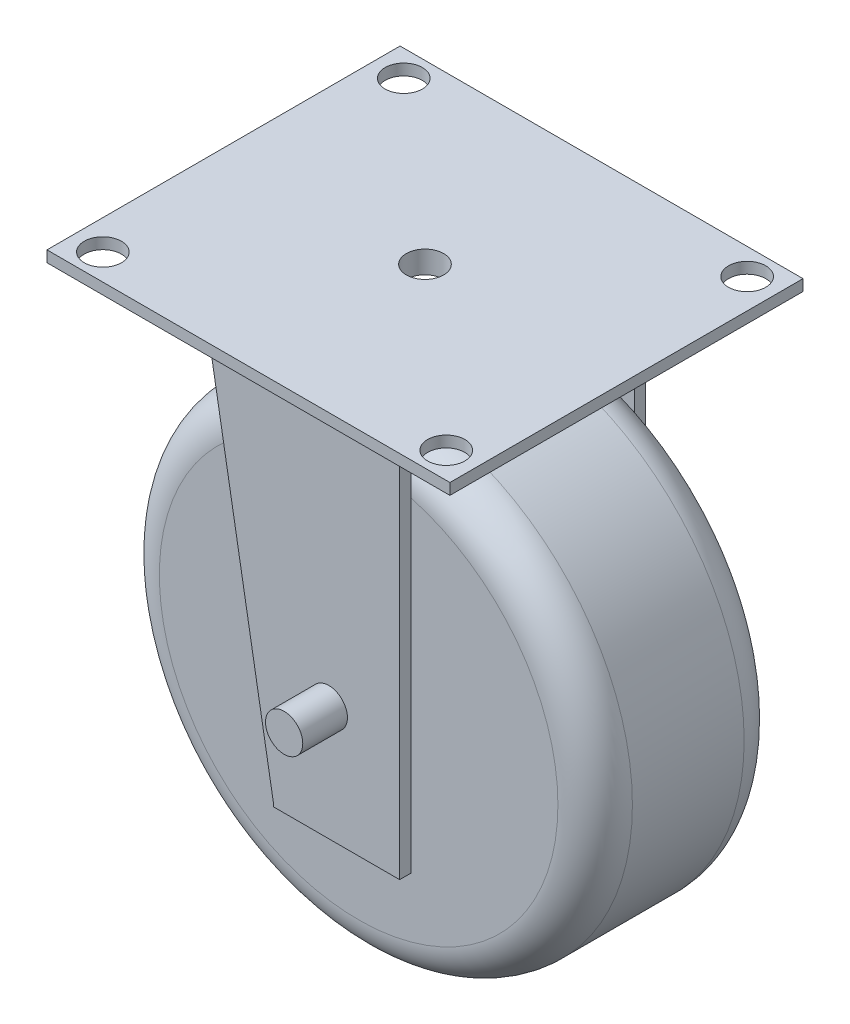
ISO-10303-21;
HEADER;
FILE_DESCRIPTION(('STEP AP214'),'2;1');
FILE_NAME('part.step','',(''),(''),'','','');
FILE_SCHEMA(('AUTOMOTIVE_DESIGN { 1 0 10303 214 1 1 1 1 }'));
ENDSEC;
DATA;
#1=APPLICATION_CONTEXT('core data for automotive mechanical design processes');
#2=APPLICATION_PROTOCOL_DEFINITION('international standard','automotive_design',2000,#1);
#3=PRODUCT_CONTEXT('',#1,'mechanical');
#4=PRODUCT('Part','Part','',(#3));
#5=PRODUCT_RELATED_PRODUCT_CATEGORY('part','',(#4));
#6=PRODUCT_DEFINITION_FORMATION('','',#4);
#7=PRODUCT_DEFINITION_CONTEXT('part definition',#1,'design');
#8=PRODUCT_DEFINITION('design','',#6,#7);
#9=PRODUCT_DEFINITION_SHAPE('','',#8);
#10=(LENGTH_UNIT() NAMED_UNIT(*) SI_UNIT(.MILLI.,.METRE.));
#11=(NAMED_UNIT(*) PLANE_ANGLE_UNIT() SI_UNIT($,.RADIAN.));
#12=(NAMED_UNIT(*) SI_UNIT($,.STERADIAN.) SOLID_ANGLE_UNIT());
#13=UNCERTAINTY_MEASURE_WITH_UNIT(LENGTH_MEASURE(1.E-05),#10,'distance_accuracy_value','');
#14=(GEOMETRIC_REPRESENTATION_CONTEXT(3) GLOBAL_UNCERTAINTY_ASSIGNED_CONTEXT((#13)) GLOBAL_UNIT_ASSIGNED_CONTEXT((#10,
#11,#12)) REPRESENTATION_CONTEXT('',''));
#15=CARTESIAN_POINT('',(0.,0.,0.));
#16=DIRECTION('',(0.,0.,1.));
#17=DIRECTION('',(1.,0.,0.));
#18=AXIS2_PLACEMENT_3D('',#15,#16,#17);
#19=CARTESIAN_POINT('',(0.,0.,70.));
#20=DIRECTION('',(0.,0.,-1.));
#21=DIRECTION('',(-1.,0.,0.));
#22=AXIS2_PLACEMENT_3D('',#19,#20,#21);
#23=CYLINDRICAL_SURFACE('',#22,5.);
#24=CARTESIAN_POINT('',(0.,0.,50.));
#25=DIRECTION('',(0.,0.,1.));
#26=DIRECTION('',(1.,0.,0.));
#27=AXIS2_PLACEMENT_3D('',#24,#25,#26);
#28=CIRCLE('',#27,5.);
#29=CARTESIAN_POINT('',(5.,0.,50.));
#30=VERTEX_POINT('',#29);
#31=EDGE_CURVE('E308',#30,#30,#28,.T.);
#32=ORIENTED_EDGE('',*,*,#31,.T.);
#33=EDGE_LOOP('',(#32));
#34=FACE_BOUND('',#33,.T.);
#35=CARTESIAN_POINT('',(0.,0.,55.));
#36=DIRECTION('',(0.,0.,1.));
#37=DIRECTION('',(1.,0.,0.));
#38=AXIS2_PLACEMENT_3D('',#35,#36,#37);
#39=CIRCLE('',#38,5.);
#40=CARTESIAN_POINT('',(5.,0.,55.));
#41=VERTEX_POINT('',#40);
#42=EDGE_CURVE('E50',#41,#41,#39,.T.);
#43=ORIENTED_EDGE('',*,*,#42,.F.);
#44=EDGE_LOOP('',(#43));
#45=FACE_BOUND('',#44,.T.);
#46=ADVANCED_FACE('F41',(#34,#45),#23,.T.);
#47=CARTESIAN_POINT('',(0.,0.,50.));
#48=DIRECTION('',(0.,0.,-1.));
#49=DIRECTION('',(-1.,0.,0.));
#50=AXIS2_PLACEMENT_3D('',#47,#48,#49);
#51=CYLINDRICAL_SURFACE('',#50,63.5);
#52=CARTESIAN_POINT('',(0.,0.,10.));
#53=DIRECTION('',(0.,0.,1.));
#54=DIRECTION('',(1.,0.,0.));
#55=AXIS2_PLACEMENT_3D('',#52,#53,#54);
#56=CIRCLE('',#55,63.5);
#57=CARTESIAN_POINT('',(63.5,0.,10.));
#58=VERTEX_POINT('',#57);
#59=EDGE_CURVE('E320',#58,#58,#56,.T.);
#60=ORIENTED_EDGE('',*,*,#59,.T.);
#61=EDGE_LOOP('',(#60));
#62=FACE_BOUND('',#61,.T.);
#63=CARTESIAN_POINT('',(0.,0.,40.));
#64=DIRECTION('',(0.,0.,1.));
#65=DIRECTION('',(1.,0.,0.));
#66=AXIS2_PLACEMENT_3D('',#63,#64,#65);
#67=CIRCLE('',#66,63.5);
#68=CARTESIAN_POINT('',(63.5,0.,40.));
#69=VERTEX_POINT('',#68);
#70=EDGE_CURVE('E317',#69,#69,#67,.F.);
#71=ORIENTED_EDGE('',*,*,#70,.T.);
#72=EDGE_LOOP('',(#71));
#73=FACE_BOUND('',#72,.T.);
#74=ADVANCED_FACE('F337',(#62,#73),#51,.T.);
#75=CARTESIAN_POINT('',(0.,0.,50.));
#76=DIRECTION('',(0.,0.,1.));
#77=DIRECTION('',(1.,0.,0.));
#78=AXIS2_PLACEMENT_3D('',#75,#76,#77);
#79=PLANE('',#78);
#80=ORIENTED_EDGE('',*,*,#31,.F.);
#81=EDGE_LOOP('',(#80));
#82=FACE_BOUND('',#81,.T.);
#83=CARTESIAN_POINT('',(0.,0.,50.));
#84=DIRECTION('',(0.,0.,1.));
#85=DIRECTION('',(1.,0.,0.));
#86=AXIS2_PLACEMENT_3D('',#83,#84,#85);
#87=CIRCLE('',#86,53.5);
#88=CARTESIAN_POINT('',(53.5,0.,50.));
#89=VERTEX_POINT('',#88);
#90=EDGE_CURVE('E326',#89,#89,#87,.T.);
#91=ORIENTED_EDGE('',*,*,#90,.T.);
#92=EDGE_LOOP('',(#91));
#93=FACE_BOUND('',#92,.T.);
#94=ADVANCED_FACE('F344',(#82,#93),#79,.T.);
#95=CARTESIAN_POINT('',(0.,0.,0.));
#96=DIRECTION('',(0.,0.,1.));
#97=DIRECTION('',(1.,0.,0.));
#98=AXIS2_PLACEMENT_3D('',#95,#96,#97);
#99=PLANE('',#98);
#100=CARTESIAN_POINT('',(0.,0.,0.));
#101=DIRECTION('',(0.,0.,1.));
#102=DIRECTION('',(1.,0.,0.));
#103=AXIS2_PLACEMENT_3D('',#100,#101,#102);
#104=CIRCLE('',#103,5.);
#105=CARTESIAN_POINT('',(5.,0.,0.));
#106=VERTEX_POINT('',#105);
#107=EDGE_CURVE('E329',#106,#106,#104,.F.);
#108=ORIENTED_EDGE('',*,*,#107,.F.);
#109=EDGE_LOOP('',(#108));
#110=FACE_BOUND('',#109,.T.);
#111=CARTESIAN_POINT('',(0.,0.,0.));
#112=DIRECTION('',(0.,0.,1.));
#113=DIRECTION('',(1.,0.,0.));
#114=AXIS2_PLACEMENT_3D('',#111,#112,#113);
#115=CIRCLE('',#114,53.5);
#116=CARTESIAN_POINT('',(53.5,0.,0.));
#117=VERTEX_POINT('',#116);
#118=EDGE_CURVE('E323',#117,#117,#115,.F.);
#119=ORIENTED_EDGE('',*,*,#118,.T.);
#120=EDGE_LOOP('',(#119));
#121=FACE_BOUND('',#120,.T.);
#122=ADVANCED_FACE('F453',(#110,#121),#99,.F.);
#123=CARTESIAN_POINT('',(0.,0.,10.));
#124=DIRECTION('',(0.,0.,1.));
#125=DIRECTION('',(1.,0.,0.));
#126=AXIS2_PLACEMENT_3D('',#123,#124,#125);
#127=TOROIDAL_SURFACE('',#126,53.5,10.);
#128=ORIENTED_EDGE('',*,*,#118,.F.);
#129=EDGE_LOOP('',(#128));
#130=FACE_BOUND('',#129,.T.);
#131=ORIENTED_EDGE('',*,*,#59,.F.);
#132=EDGE_LOOP('',(#131));
#133=FACE_BOUND('',#132,.T.);
#134=ADVANCED_FACE('F456',(#130,#133),#127,.T.);
#135=CARTESIAN_POINT('',(0.,0.,40.));
#136=DIRECTION('',(0.,0.,1.));
#137=DIRECTION('',(1.,0.,0.));
#138=AXIS2_PLACEMENT_3D('',#135,#136,#137);
#139=TOROIDAL_SURFACE('',#138,53.5,10.);
#140=ORIENTED_EDGE('',*,*,#70,.F.);
#141=EDGE_LOOP('',(#140));
#142=FACE_BOUND('',#141,.T.);
#143=ORIENTED_EDGE('',*,*,#90,.F.);
#144=EDGE_LOOP('',(#143));
#145=FACE_BOUND('',#144,.T.);
#146=ADVANCED_FACE('F43',(#142,#145),#139,.T.);
#147=CARTESIAN_POINT('',(0.,0.,-20.));
#148=DIRECTION('',(0.,0.,1.));
#149=DIRECTION('',(1.,0.,0.));
#150=AXIS2_PLACEMENT_3D('',#147,#148,#149);
#151=CYLINDRICAL_SURFACE('',#150,5.);
#152=CARTESIAN_POINT('',(0.,0.,-5.));
#153=DIRECTION('',(0.,0.,1.));
#154=DIRECTION('',(1.,0.,0.));
#155=AXIS2_PLACEMENT_3D('',#152,#153,#154);
#156=CIRCLE('',#155,5.);
#157=CARTESIAN_POINT('',(5.,0.,-5.));
#158=VERTEX_POINT('',#157);
#159=EDGE_CURVE('E244',#158,#158,#156,.T.);
#160=ORIENTED_EDGE('',*,*,#159,.T.);
#161=EDGE_LOOP('',(#160));
#162=FACE_BOUND('',#161,.T.);
#163=ORIENTED_EDGE('',*,*,#107,.T.);
#164=EDGE_LOOP('',(#163));
#165=FACE_BOUND('',#164,.T.);
#166=ADVANCED_FACE('F368',(#162,#165),#151,.T.);
#167=CARTESIAN_POINT('',(0.,0.,58.));
#168=DIRECTION('',(0.,0.,1.));
#169=DIRECTION('',(1.,0.,0.));
#170=AXIS2_PLACEMENT_3D('',#167,#168,#169);
#171=PLANE('',#170);
#172=DIRECTION('',(0.,-1.,0.));
#173=VECTOR('',#172,1.);
#174=CARTESIAN_POINT('',(-14.8477102055952,-29.8965705802547,58.));
#175=LINE('',#174,#173);
#176=CARTESIAN_POINT('',(-14.8477102055952,-29.8965705802547,58.));
#177=VERTEX_POINT('',#176);
#178=CARTESIAN_POINT('',(-14.8477102055952,-30.6411344370243,58.));
#179=VERTEX_POINT('',#178);
#180=EDGE_CURVE('E285',#177,#179,#175,.T.);
#181=ORIENTED_EDGE('',*,*,#180,.T.);
#182=DIRECTION('',(1.,0.,0.));
#183=VECTOR('',#182,1.);
#184=CARTESIAN_POINT('',(-14.8477102055952,-30.6411344370243,58.));
#185=LINE('',#184,#183);
#186=CARTESIAN_POINT('',(19.0088519192652,-30.6411344370243,58.));
#187=VERTEX_POINT('',#186);
#188=EDGE_CURVE('E91',#179,#187,#185,.T.);
#189=ORIENTED_EDGE('',*,*,#188,.T.);
#190=DIRECTION('',(0.,1.,0.));
#191=VECTOR('',#190,1.);
#192=CARTESIAN_POINT('',(19.0088519192652,-30.6411344370243,58.));
#193=LINE('',#192,#191);
#194=CARTESIAN_POINT('',(19.0088519192652,79.8505182146156,58.));
#195=VERTEX_POINT('',#194);
#196=EDGE_CURVE('E288',#187,#195,#193,.T.);
#197=ORIENTED_EDGE('',*,*,#196,.T.);
#198=DIRECTION('',(1.,0.,0.));
#199=VECTOR('',#198,1.);
#200=CARTESIAN_POINT('',(-33.3756531336716,79.8505182146156,58.));
#201=LINE('',#200,#199);
#202=CARTESIAN_POINT('',(-33.3756531336716,79.8505182146156,58.));
#203=VERTEX_POINT('',#202);
#204=EDGE_CURVE('E227',#203,#195,#201,.T.);
#205=ORIENTED_EDGE('',*,*,#204,.F.);
#206=DIRECTION('',(0.,-1.,0.));
#207=VECTOR('',#206,1.);
#208=CARTESIAN_POINT('',(-33.3756531336716,79.8505182146156,58.));
#209=LINE('',#208,#207);
#210=CARTESIAN_POINT('',(-33.3756531336716,76.8505182146156,58.));
#211=VERTEX_POINT('',#210);
#212=EDGE_CURVE('E242',#203,#211,#209,.T.);
#213=ORIENTED_EDGE('',*,*,#212,.T.);
#214=DIRECTION('',(0.171011760377526,-0.985268987542275,0.));
#215=VECTOR('',#214,1.);
#216=CARTESIAN_POINT('',(-33.3756531336716,76.8505182146156,58.));
#217=LINE('',#216,#215);
#218=EDGE_CURVE('E58',#211,#177,#217,.T.);
#219=ORIENTED_EDGE('',*,*,#218,.T.);
#220=EDGE_LOOP('',(#181,#189,#197,#205,#213,#219));
#221=FACE_BOUND('',#220,.T.);
#222=CARTESIAN_POINT('',(0.,0.,58.));
#223=DIRECTION('',(0.,0.,1.));
#224=DIRECTION('',(1.,0.,0.));
#225=AXIS2_PLACEMENT_3D('',#222,#223,#224);
#226=CIRCLE('',#225,5.);
#227=CARTESIAN_POINT('',(5.,0.,58.));
#228=VERTEX_POINT('',#227);
#229=EDGE_CURVE('E281',#228,#228,#226,.T.);
#230=ORIENTED_EDGE('',*,*,#229,.F.);
#231=EDGE_LOOP('',(#230));
#232=FACE_BOUND('',#231,.T.);
#233=ADVANCED_FACE('F366',(#221,#232),#171,.T.);
#234=CARTESIAN_POINT('',(0.,0.,55.));
#235=DIRECTION('',(0.,0.,1.));
#236=DIRECTION('',(1.,0.,0.));
#237=AXIS2_PLACEMENT_3D('',#234,#235,#236);
#238=PLANE('',#237);
#239=DIRECTION('',(0.,-1.,0.));
#240=VECTOR('',#239,1.);
#241=CARTESIAN_POINT('',(-14.8477102055952,-29.8965705802547,55.));
#242=LINE('',#241,#240);
#243=CARTESIAN_POINT('',(-14.8477102055952,-29.8965705802547,55.));
#244=VERTEX_POINT('',#243);
#245=CARTESIAN_POINT('',(-14.8477102055952,-30.6411344370243,55.));
#246=VERTEX_POINT('',#245);
#247=EDGE_CURVE('E284',#244,#246,#242,.T.);
#248=ORIENTED_EDGE('',*,*,#247,.F.);
#249=DIRECTION('',(0.171011760377526,-0.985268987542275,0.));
#250=VECTOR('',#249,1.);
#251=CARTESIAN_POINT('',(-33.3756531336716,76.8505182146156,55.));
#252=LINE('',#251,#250);
#253=CARTESIAN_POINT('',(-33.3756531336716,76.8505182146156,55.));
#254=VERTEX_POINT('',#253);
#255=EDGE_CURVE('E83',#254,#244,#252,.T.);
#256=ORIENTED_EDGE('',*,*,#255,.F.);
#257=DIRECTION('',(-1.,0.,0.));
#258=VECTOR('',#257,1.);
#259=CARTESIAN_POINT('',(19.0088519192652,76.8505182146156,55.));
#260=LINE('',#259,#258);
#261=CARTESIAN_POINT('',(19.0088519192652,76.8505182146156,55.));
#262=VERTEX_POINT('',#261);
#263=EDGE_CURVE('E297',#262,#254,#260,.T.);
#264=ORIENTED_EDGE('',*,*,#263,.F.);
#265=DIRECTION('',(0.,1.,0.));
#266=VECTOR('',#265,1.);
#267=CARTESIAN_POINT('',(19.0088519192652,-30.6411344370243,55.));
#268=LINE('',#267,#266);
#269=CARTESIAN_POINT('',(19.0088519192652,-30.6411344370243,55.));
#270=VERTEX_POINT('',#269);
#271=EDGE_CURVE('E76',#270,#262,#268,.T.);
#272=ORIENTED_EDGE('',*,*,#271,.F.);
#273=DIRECTION('',(1.,0.,0.));
#274=VECTOR('',#273,1.);
#275=CARTESIAN_POINT('',(-14.8477102055952,-30.6411344370243,55.));
#276=LINE('',#275,#274);
#277=EDGE_CURVE('E294',#246,#270,#276,.T.);
#278=ORIENTED_EDGE('',*,*,#277,.F.);
#279=EDGE_LOOP('',(#248,#256,#264,#272,#278));
#280=FACE_BOUND('',#279,.T.);
#281=ORIENTED_EDGE('',*,*,#42,.T.);
#282=EDGE_LOOP('',(#281));
#283=FACE_BOUND('',#282,.T.);
#284=ADVANCED_FACE('F334',(#280,#283),#238,.F.);
#285=CARTESIAN_POINT('',(-14.8477102055952,-29.8965705802547,58.));
#286=DIRECTION('',(1.,0.,0.));
#287=DIRECTION('',(0.,0.,-1.));
#288=AXIS2_PLACEMENT_3D('',#285,#286,#287);
#289=PLANE('',#288);
#290=ORIENTED_EDGE('',*,*,#247,.T.);
#291=DIRECTION('',(0.,0.,-1.));
#292=VECTOR('',#291,1.);
#293=CARTESIAN_POINT('',(-14.8477102055952,-30.6411344370243,58.));
#294=LINE('',#293,#292);
#295=EDGE_CURVE('E306',#179,#246,#294,.T.);
#296=ORIENTED_EDGE('',*,*,#295,.F.);
#297=ORIENTED_EDGE('',*,*,#180,.F.);
#298=DIRECTION('',(0.,0.,-1.));
#299=VECTOR('',#298,1.);
#300=CARTESIAN_POINT('',(-14.8477102055952,-29.8965705802547,58.));
#301=LINE('',#300,#299);
#302=EDGE_CURVE('E291',#177,#244,#301,.T.);
#303=ORIENTED_EDGE('',*,*,#302,.T.);
#304=EDGE_LOOP('',(#290,#296,#297,#303));
#305=FACE_BOUND('',#304,.T.);
#306=ADVANCED_FACE('F374',(#305),#289,.F.);
#307=CARTESIAN_POINT('',(-14.8477102055952,-30.6411344370243,58.));
#308=DIRECTION('',(0.,1.,0.));
#309=DIRECTION('',(0.,0.,1.));
#310=AXIS2_PLACEMENT_3D('',#307,#308,#309);
#311=PLANE('',#310);
#312=ORIENTED_EDGE('',*,*,#277,.T.);
#313=DIRECTION('',(0.,0.,-1.));
#314=VECTOR('',#313,1.);
#315=CARTESIAN_POINT('',(19.0088519192652,-30.6411344370243,58.));
#316=LINE('',#315,#314);
#317=EDGE_CURVE('E304',#187,#270,#316,.T.);
#318=ORIENTED_EDGE('',*,*,#317,.F.);
#319=ORIENTED_EDGE('',*,*,#188,.F.);
#320=ORIENTED_EDGE('',*,*,#295,.T.);
#321=EDGE_LOOP('',(#312,#318,#319,#320));
#322=FACE_BOUND('',#321,.T.);
#323=ADVANCED_FACE('F389',(#322),#311,.F.);
#324=CARTESIAN_POINT('',(19.0088519192652,-30.6411344370243,58.));
#325=DIRECTION('',(-1.,0.,0.));
#326=DIRECTION('',(0.,0.,1.));
#327=AXIS2_PLACEMENT_3D('',#324,#325,#326);
#328=PLANE('',#327);
#329=ORIENTED_EDGE('',*,*,#271,.T.);
#330=DIRECTION('',(0.,0.,-1.));
#331=VECTOR('',#330,1.);
#332=CARTESIAN_POINT('',(19.0088519192652,76.8505182146156,-8.));
#333=LINE('',#332,#331);
#334=CARTESIAN_POINT('',(19.0088519192652,76.8505182146156,-5.));
#335=VERTEX_POINT('',#334);
#336=EDGE_CURVE('E228',#262,#335,#333,.T.);
#337=ORIENTED_EDGE('',*,*,#336,.T.);
#338=DIRECTION('',(0.,1.,0.));
#339=VECTOR('',#338,1.);
#340=CARTESIAN_POINT('',(19.0088519192652,-30.6411344370243,-5.));
#341=LINE('',#340,#339);
#342=CARTESIAN_POINT('',(19.0088519192652,-30.6411344370243,-5.));
#343=VERTEX_POINT('',#342);
#344=EDGE_CURVE('E254',#343,#335,#341,.T.);
#345=ORIENTED_EDGE('',*,*,#344,.F.);
#346=DIRECTION('',(0.,0.,-1.));
#347=VECTOR('',#346,1.);
#348=CARTESIAN_POINT('',(19.0088519192652,-30.6411344370243,-5.));
#349=LINE('',#348,#347);
#350=CARTESIAN_POINT('',(19.0088519192652,-30.6411344370243,-8.));
#351=VERTEX_POINT('',#350);
#352=EDGE_CURVE('E275',#343,#351,#349,.T.);
#353=ORIENTED_EDGE('',*,*,#352,.T.);
#354=DIRECTION('',(0.,1.,0.));
#355=VECTOR('',#354,1.);
#356=CARTESIAN_POINT('',(19.0088519192652,-30.6411344370243,-8.));
#357=LINE('',#356,#355);
#358=CARTESIAN_POINT('',(19.0088519192652,79.8505182146156,-8.));
#359=VERTEX_POINT('',#358);
#360=EDGE_CURVE('E267',#351,#359,#357,.T.);
#361=ORIENTED_EDGE('',*,*,#360,.T.);
#362=DIRECTION('',(0.,0.,-1.));
#363=VECTOR('',#362,1.);
#364=CARTESIAN_POINT('',(19.0088519192652,79.8505182146156,-8.));
#365=LINE('',#364,#363);
#366=EDGE_CURVE('E231',#195,#359,#365,.T.);
#367=ORIENTED_EDGE('',*,*,#366,.F.);
#368=ORIENTED_EDGE('',*,*,#196,.F.);
#369=ORIENTED_EDGE('',*,*,#317,.T.);
#370=EDGE_LOOP('',(#329,#337,#345,#353,#361,#367,#368,#369));
#371=FACE_BOUND('',#370,.T.);
#372=ADVANCED_FACE('F386',(#371),#328,.F.);
#373=CARTESIAN_POINT('',(-33.3756531336716,76.8505182146156,58.));
#374=DIRECTION('',(0.985268987542275,0.171011760377526,0.));
#375=DIRECTION('',(-0.171011760377526,0.985268987542275,0.));
#376=AXIS2_PLACEMENT_3D('',#373,#374,#375);
#377=PLANE('',#376);
#378=ORIENTED_EDGE('',*,*,#255,.T.);
#379=ORIENTED_EDGE('',*,*,#302,.F.);
#380=ORIENTED_EDGE('',*,*,#218,.F.);
#381=DIRECTION('',(0.,0.,-1.));
#382=VECTOR('',#381,1.);
#383=CARTESIAN_POINT('',(-33.3756531336716,76.8505182146156,58.));
#384=LINE('',#383,#382);
#385=EDGE_CURVE('E302',#211,#254,#384,.T.);
#386=ORIENTED_EDGE('',*,*,#385,.T.);
#387=EDGE_LOOP('',(#378,#379,#380,#386));
#388=FACE_BOUND('',#387,.T.);
#389=ADVANCED_FACE('F360',(#388),#377,.F.);
#390=CARTESIAN_POINT('',(0.,0.,70.));
#391=DIRECTION('',(0.,0.,1.));
#392=DIRECTION('',(1.,0.,0.));
#393=AXIS2_PLACEMENT_3D('',#390,#391,#392);
#394=PLANE('',#393);
#395=CARTESIAN_POINT('',(0.,0.,70.));
#396=DIRECTION('',(0.,0.,1.));
#397=DIRECTION('',(1.,0.,0.));
#398=AXIS2_PLACEMENT_3D('',#395,#396,#397);
#399=CIRCLE('',#398,5.);
#400=CARTESIAN_POINT('',(5.,0.,70.));
#401=VERTEX_POINT('',#400);
#402=EDGE_CURVE('E309',#401,#401,#399,.T.);
#403=ORIENTED_EDGE('',*,*,#402,.T.);
#404=EDGE_LOOP('',(#403));
#405=FACE_BOUND('',#404,.T.);
#406=ADVANCED_FACE('F351',(#405),#394,.T.);
#407=ORIENTED_EDGE('',*,*,#229,.T.);
#408=EDGE_LOOP('',(#407));
#409=FACE_BOUND('',#408,.T.);
#410=ORIENTED_EDGE('',*,*,#402,.F.);
#411=EDGE_LOOP('',(#410));
#412=FACE_BOUND('',#411,.T.);
#413=ADVANCED_FACE('F340',(#409,#412),#23,.T.);
#414=CARTESIAN_POINT('',(0.,0.,-5.));
#415=DIRECTION('',(0.,0.,1.));
#416=DIRECTION('',(1.,0.,0.));
#417=AXIS2_PLACEMENT_3D('',#414,#415,#416);
#418=PLANE('',#417);
#419=DIRECTION('',(0.,-1.,0.));
#420=VECTOR('',#419,1.);
#421=CARTESIAN_POINT('',(-14.8477102055952,-29.8965705802547,-5.));
#422=LINE('',#421,#420);
#423=CARTESIAN_POINT('',(-14.8477102055952,-29.8965705802547,-5.));
#424=VERTEX_POINT('',#423);
#425=CARTESIAN_POINT('',(-14.8477102055952,-30.6411344370243,-5.));
#426=VERTEX_POINT('',#425);
#427=EDGE_CURVE('E248',#424,#426,#422,.T.);
#428=ORIENTED_EDGE('',*,*,#427,.T.);
#429=DIRECTION('',(1.,0.,0.));
#430=VECTOR('',#429,1.);
#431=CARTESIAN_POINT('',(-14.8477102055952,-30.6411344370243,-5.));
#432=LINE('',#431,#430);
#433=EDGE_CURVE('E251',#426,#343,#432,.T.);
#434=ORIENTED_EDGE('',*,*,#433,.T.);
#435=ORIENTED_EDGE('',*,*,#344,.T.);
#436=DIRECTION('',(-1.,0.,0.));
#437=VECTOR('',#436,1.);
#438=CARTESIAN_POINT('',(19.0088519192652,76.8505182146156,-5.));
#439=LINE('',#438,#437);
#440=CARTESIAN_POINT('',(-33.3756531336716,76.8505182146156,-5.));
#441=VERTEX_POINT('',#440);
#442=EDGE_CURVE('E257',#335,#441,#439,.T.);
#443=ORIENTED_EDGE('',*,*,#442,.T.);
#444=DIRECTION('',(0.171011760377526,-0.985268987542275,0.));
#445=VECTOR('',#444,1.);
#446=CARTESIAN_POINT('',(-33.3756531336716,76.8505182146156,-5.));
#447=LINE('',#446,#445);
#448=EDGE_CURVE('E260',#441,#424,#447,.T.);
#449=ORIENTED_EDGE('',*,*,#448,.T.);
#450=EDGE_LOOP('',(#428,#434,#435,#443,#449));
#451=FACE_BOUND('',#450,.T.);
#452=ORIENTED_EDGE('',*,*,#159,.F.);
#453=EDGE_LOOP('',(#452));
#454=FACE_BOUND('',#453,.T.);
#455=ADVANCED_FACE('F350',(#451,#454),#418,.T.);
#456=CARTESIAN_POINT('',(0.,0.,-8.));
#457=DIRECTION('',(0.,0.,1.));
#458=DIRECTION('',(1.,0.,0.));
#459=AXIS2_PLACEMENT_3D('',#456,#457,#458);
#460=PLANE('',#459);
#461=DIRECTION('',(0.,-1.,0.));
#462=VECTOR('',#461,1.);
#463=CARTESIAN_POINT('',(-14.8477102055952,-29.8965705802547,-8.));
#464=LINE('',#463,#462);
#465=CARTESIAN_POINT('',(-14.8477102055952,-29.8965705802547,-8.));
#466=VERTEX_POINT('',#465);
#467=CARTESIAN_POINT('',(-14.8477102055952,-30.6411344370243,-8.));
#468=VERTEX_POINT('',#467);
#469=EDGE_CURVE('E247',#466,#468,#464,.T.);
#470=ORIENTED_EDGE('',*,*,#469,.F.);
#471=DIRECTION('',(0.171011760377526,-0.985268987542275,0.));
#472=VECTOR('',#471,1.);
#473=CARTESIAN_POINT('',(-33.3756531336716,76.8505182146156,-8.));
#474=LINE('',#473,#472);
#475=CARTESIAN_POINT('',(-33.3756531336716,76.8505182146156,-8.));
#476=VERTEX_POINT('',#475);
#477=EDGE_CURVE('E252',#476,#466,#474,.T.);
#478=ORIENTED_EDGE('',*,*,#477,.F.);
#479=DIRECTION('',(0.,-1.,0.));
#480=VECTOR('',#479,1.);
#481=CARTESIAN_POINT('',(-33.3756531336716,79.8505182146156,-8.));
#482=LINE('',#481,#480);
#483=CARTESIAN_POINT('',(-33.3756531336716,79.8505182146156,-8.));
#484=VERTEX_POINT('',#483);
#485=EDGE_CURVE('E237',#484,#476,#482,.T.);
#486=ORIENTED_EDGE('',*,*,#485,.F.);
#487=DIRECTION('',(-1.,0.,0.));
#488=VECTOR('',#487,1.);
#489=CARTESIAN_POINT('',(-33.3756531336716,79.8505182146156,-8.));
#490=LINE('',#489,#488);
#491=EDGE_CURVE('E234',#359,#484,#490,.T.);
#492=ORIENTED_EDGE('',*,*,#491,.F.);
#493=ORIENTED_EDGE('',*,*,#360,.F.);
#494=DIRECTION('',(1.,0.,0.));
#495=VECTOR('',#494,1.);
#496=CARTESIAN_POINT('',(-14.8477102055952,-30.6411344370243,-8.));
#497=LINE('',#496,#495);
#498=EDGE_CURVE('E265',#468,#351,#497,.T.);
#499=ORIENTED_EDGE('',*,*,#498,.F.);
#500=EDGE_LOOP('',(#470,#478,#486,#492,#493,#499));
#501=FACE_BOUND('',#500,.T.);
#502=CARTESIAN_POINT('',(0.,0.,-8.));
#503=DIRECTION('',(0.,0.,1.));
#504=DIRECTION('',(1.,0.,0.));
#505=AXIS2_PLACEMENT_3D('',#502,#503,#504);
#506=CIRCLE('',#505,5.);
#507=CARTESIAN_POINT('',(5.,0.,-8.));
#508=VERTEX_POINT('',#507);
#509=EDGE_CURVE('E11',#508,#508,#506,.T.);
#510=ORIENTED_EDGE('',*,*,#509,.T.);
#511=EDGE_LOOP('',(#510));
#512=FACE_BOUND('',#511,.T.);
#513=ADVANCED_FACE('F357',(#501,#512),#460,.F.);
#514=CARTESIAN_POINT('',(-14.8477102055952,-29.8965705802547,-5.));
#515=DIRECTION('',(1.,0.,0.));
#516=DIRECTION('',(0.,0.,-1.));
#517=AXIS2_PLACEMENT_3D('',#514,#515,#516);
#518=PLANE('',#517);
#519=ORIENTED_EDGE('',*,*,#469,.T.);
#520=DIRECTION('',(0.,0.,-1.));
#521=VECTOR('',#520,1.);
#522=CARTESIAN_POINT('',(-14.8477102055952,-30.6411344370243,-5.));
#523=LINE('',#522,#521);
#524=EDGE_CURVE('E278',#426,#468,#523,.T.);
#525=ORIENTED_EDGE('',*,*,#524,.F.);
#526=ORIENTED_EDGE('',*,*,#427,.F.);
#527=DIRECTION('',(0.,0.,-1.));
#528=VECTOR('',#527,1.);
#529=CARTESIAN_POINT('',(-14.8477102055952,-29.8965705802547,-5.));
#530=LINE('',#529,#528);
#531=EDGE_CURVE('E262',#424,#466,#530,.T.);
#532=ORIENTED_EDGE('',*,*,#531,.T.);
#533=EDGE_LOOP('',(#519,#525,#526,#532));
#534=FACE_BOUND('',#533,.T.);
#535=ADVANCED_FACE('F381',(#534),#518,.F.);
#536=CARTESIAN_POINT('',(-14.8477102055952,-30.6411344370243,-5.));
#537=DIRECTION('',(0.,1.,0.));
#538=DIRECTION('',(0.,0.,1.));
#539=AXIS2_PLACEMENT_3D('',#536,#537,#538);
#540=PLANE('',#539);
#541=ORIENTED_EDGE('',*,*,#498,.T.);
#542=ORIENTED_EDGE('',*,*,#352,.F.);
#543=ORIENTED_EDGE('',*,*,#433,.F.);
#544=ORIENTED_EDGE('',*,*,#524,.T.);
#545=EDGE_LOOP('',(#541,#542,#543,#544));
#546=FACE_BOUND('',#545,.T.);
#547=ADVANCED_FACE('F428',(#546),#540,.F.);
#548=CARTESIAN_POINT('',(-33.3756531336716,76.8505182146156,-5.));
#549=DIRECTION('',(0.985268987542275,0.171011760377526,0.));
#550=DIRECTION('',(-0.171011760377526,0.985268987542275,0.));
#551=AXIS2_PLACEMENT_3D('',#548,#549,#550);
#552=PLANE('',#551);
#553=ORIENTED_EDGE('',*,*,#477,.T.);
#554=ORIENTED_EDGE('',*,*,#531,.F.);
#555=ORIENTED_EDGE('',*,*,#448,.F.);
#556=DIRECTION('',(0.,0.,-1.));
#557=VECTOR('',#556,1.);
#558=CARTESIAN_POINT('',(-33.3756531336716,76.8505182146156,-5.));
#559=LINE('',#558,#557);
#560=EDGE_CURVE('E272',#441,#476,#559,.T.);
#561=ORIENTED_EDGE('',*,*,#560,.T.);
#562=EDGE_LOOP('',(#553,#554,#555,#561));
#563=FACE_BOUND('',#562,.T.);
#564=ADVANCED_FACE('F417',(#563),#552,.F.);
#565=CARTESIAN_POINT('',(0.,0.,-20.));
#566=DIRECTION('',(0.,0.,-1.));
#567=DIRECTION('',(-1.,0.,0.));
#568=AXIS2_PLACEMENT_3D('',#565,#566,#567);
#569=PLANE('',#568);
#570=CARTESIAN_POINT('',(0.,0.,-20.));
#571=DIRECTION('',(0.,0.,-1.));
#572=DIRECTION('',(-1.,0.,0.));
#573=AXIS2_PLACEMENT_3D('',#570,#571,#572);
#574=CIRCLE('',#573,5.);
#575=CARTESIAN_POINT('',(-5.,0.,-20.));
#576=VERTEX_POINT('',#575);
#577=EDGE_CURVE('E312',#576,#576,#574,.T.);
#578=ORIENTED_EDGE('',*,*,#577,.T.);
#579=EDGE_LOOP('',(#578));
#580=FACE_BOUND('',#579,.T.);
#581=ADVANCED_FACE('F441',(#580),#569,.T.);
#582=ORIENTED_EDGE('',*,*,#577,.F.);
#583=EDGE_LOOP('',(#582));
#584=FACE_BOUND('',#583,.T.);
#585=ORIENTED_EDGE('',*,*,#509,.F.);
#586=EDGE_LOOP('',(#585));
#587=FACE_BOUND('',#586,.T.);
#588=ADVANCED_FACE('F379',(#584,#587),#151,.T.);
#589=CARTESIAN_POINT('',(0.,76.8505182146156,0.));
#590=DIRECTION('',(0.,1.,0.));
#591=DIRECTION('',(0.,0.,1.));
#592=AXIS2_PLACEMENT_3D('',#589,#590,#591);
#593=PLANE('',#592);
#594=CARTESIAN_POINT('',(-7.18340060720319,76.8505182146156,25.));
#595=DIRECTION('',(0.,1.,0.));
#596=DIRECTION('',(0.,0.,1.));
#597=AXIS2_PLACEMENT_3D('',#594,#595,#596);
#598=CIRCLE('',#597,5.);
#599=CARTESIAN_POINT('',(-7.18340060720319,76.8505182146156,30.));
#600=VERTEX_POINT('',#599);
#601=EDGE_CURVE('E169',#600,#600,#598,.T.);
#602=ORIENTED_EDGE('',*,*,#601,.T.);
#603=EDGE_LOOP('',(#602));
#604=FACE_BOUND('',#603,.T.);
#605=ORIENTED_EDGE('',*,*,#336,.F.);
#606=ORIENTED_EDGE('',*,*,#263,.T.);
#607=DIRECTION('',(0.,0.,1.));
#608=VECTOR('',#607,1.);
#609=CARTESIAN_POINT('',(-33.3756531336716,76.8505182146156,-8.));
#610=LINE('',#609,#608);
#611=EDGE_CURVE('E223',#441,#254,#610,.T.);
#612=ORIENTED_EDGE('',*,*,#611,.F.);
#613=ORIENTED_EDGE('',*,*,#442,.F.);
#614=EDGE_LOOP('',(#605,#606,#612,#613));
#615=FACE_BOUND('',#614,.T.);
#616=ADVANCED_FACE('F425',(#604,#615),#593,.F.);
#617=CARTESIAN_POINT('',(-33.3756531336716,79.8505182146156,-8.));
#618=DIRECTION('',(1.,0.,0.));
#619=DIRECTION('',(0.,0.,-1.));
#620=AXIS2_PLACEMENT_3D('',#617,#618,#619);
#621=PLANE('',#620);
#622=ORIENTED_EDGE('',*,*,#560,.F.);
#623=ORIENTED_EDGE('',*,*,#611,.T.);
#624=ORIENTED_EDGE('',*,*,#385,.F.);
#625=ORIENTED_EDGE('',*,*,#212,.F.);
#626=DIRECTION('',(0.,0.,1.));
#627=VECTOR('',#626,1.);
#628=CARTESIAN_POINT('',(-33.3756531336716,79.8505182146156,-8.));
#629=LINE('',#628,#627);
#630=EDGE_CURVE('E224',#484,#203,#629,.T.);
#631=ORIENTED_EDGE('',*,*,#630,.F.);
#632=ORIENTED_EDGE('',*,*,#485,.T.);
#633=EDGE_LOOP('',(#622,#623,#624,#625,#631,#632));
#634=FACE_BOUND('',#633,.T.);
#635=ADVANCED_FACE('F405',(#634),#621,.F.);
#636=CARTESIAN_POINT('',(-7.18340060720319,76.8505182146156,25.));
#637=DIRECTION('',(0.,1.,0.));
#638=DIRECTION('',(0.,0.,1.));
#639=AXIS2_PLACEMENT_3D('',#636,#637,#638);
#640=CYLINDRICAL_SURFACE('',#639,5.);
#641=ORIENTED_EDGE('',*,*,#601,.F.);
#642=EDGE_LOOP('',(#641));
#643=FACE_BOUND('',#642,.T.);
#644=CARTESIAN_POINT('',(-7.18340060720319,82.8505182146156,25.));
#645=DIRECTION('',(0.,1.,0.));
#646=DIRECTION('',(0.,0.,1.));
#647=AXIS2_PLACEMENT_3D('',#644,#645,#646);
#648=CIRCLE('',#647,5.);
#649=CARTESIAN_POINT('',(-7.18340060720319,82.8505182146156,30.));
#650=VERTEX_POINT('',#649);
#651=EDGE_CURVE('E190',#650,#650,#648,.F.);
#652=ORIENTED_EDGE('',*,*,#651,.F.);
#653=EDGE_LOOP('',(#652));
#654=FACE_BOUND('',#653,.T.);
#655=ADVANCED_FACE('F567',(#643,#654),#640,.F.);
#656=CARTESIAN_POINT('',(0.,79.8505182146156,0.));
#657=DIRECTION('',(0.,1.,0.));
#658=DIRECTION('',(0.,0.,1.));
#659=AXIS2_PLACEMENT_3D('',#656,#657,#658);
#660=PLANE('',#659);
#661=DIRECTION('',(0.,0.,1.));
#662=VECTOR('',#661,1.);
#663=CARTESIAN_POINT('',(46.906418941355,79.8505182146156,0.));
#664=LINE('',#663,#662);
#665=CARTESIAN_POINT('',(46.906418941355,79.8505182146156,-22.3978866410766));
#666=VERTEX_POINT('',#665);
#667=CARTESIAN_POINT('',(46.906418941355,79.8505182146156,72.3978866410766));
#668=VERTEX_POINT('',#667);
#669=EDGE_CURVE('E164',#666,#668,#664,.T.);
#670=ORIENTED_EDGE('',*,*,#669,.T.);
#671=DIRECTION('',(1.,0.,0.));
#672=VECTOR('',#671,1.);
#673=CARTESIAN_POINT('',(0.,79.8505182146156,72.3978866410766));
#674=LINE('',#673,#672);
#675=CARTESIAN_POINT('',(-61.2732201557614,79.8505182146156,72.3978866410766));
#676=VERTEX_POINT('',#675);
#677=EDGE_CURVE('E212',#676,#668,#674,.T.);
#678=ORIENTED_EDGE('',*,*,#677,.F.);
#679=DIRECTION('',(0.,0.,1.));
#680=VECTOR('',#679,1.);
#681=CARTESIAN_POINT('',(-61.2732201557614,79.8505182146156,0.));
#682=LINE('',#681,#680);
#683=CARTESIAN_POINT('',(-61.2732201557614,79.8505182146156,-22.3978866410766));
#684=VERTEX_POINT('',#683);
#685=EDGE_CURVE('E209',#684,#676,#682,.T.);
#686=ORIENTED_EDGE('',*,*,#685,.F.);
#687=DIRECTION('',(1.,0.,0.));
#688=VECTOR('',#687,1.);
#689=CARTESIAN_POINT('',(0.,79.8505182146156,-22.3978866410766));
#690=LINE('',#689,#688);
#691=EDGE_CURVE('E207',#684,#666,#690,.T.);
#692=ORIENTED_EDGE('',*,*,#691,.T.);
#693=EDGE_LOOP('',(#670,#678,#686,#692));
#694=FACE_BOUND('',#693,.T.);
#695=CARTESIAN_POINT('',(-53.2775264538853,79.8505182146156,-15.3914113586425));
#696=DIRECTION('',(0.,1.,0.));
#697=DIRECTION('',(0.,0.,1.));
#698=AXIS2_PLACEMENT_3D('',#695,#696,#697);
#699=CIRCLE('',#698,5.);
#700=CARTESIAN_POINT('',(-53.2775264538853,79.8505182146156,-10.3914113586425));
#701=VERTEX_POINT('',#700);
#702=EDGE_CURVE('E203',#701,#701,#699,.T.);
#703=ORIENTED_EDGE('',*,*,#702,.T.);
#704=EDGE_LOOP('',(#703));
#705=FACE_BOUND('',#704,.T.);
#706=CARTESIAN_POINT('',(-53.2775264538853,79.8505182146156,65.3914113586425));
#707=DIRECTION('',(0.,1.,0.));
#708=DIRECTION('',(0.,0.,1.));
#709=AXIS2_PLACEMENT_3D('',#706,#707,#708);
#710=CIRCLE('',#709,5.);
#711=CARTESIAN_POINT('',(-53.2775264538853,79.8505182146156,70.3914113586425));
#712=VERTEX_POINT('',#711);
#713=EDGE_CURVE('E200',#712,#712,#710,.T.);
#714=ORIENTED_EDGE('',*,*,#713,.T.);
#715=EDGE_LOOP('',(#714));
#716=FACE_BOUND('',#715,.T.);
#717=CARTESIAN_POINT('',(38.9107252394789,79.8505182146156,-15.3914113586425));
#718=DIRECTION('',(0.,1.,0.));
#719=DIRECTION('',(0.,0.,1.));
#720=AXIS2_PLACEMENT_3D('',#717,#718,#719);
#721=CIRCLE('',#720,5.);
#722=CARTESIAN_POINT('',(38.9107252394789,79.8505182146156,-10.3914113586425));
#723=VERTEX_POINT('',#722);
#724=EDGE_CURVE('E197',#723,#723,#721,.T.);
#725=ORIENTED_EDGE('',*,*,#724,.T.);
#726=EDGE_LOOP('',(#725));
#727=FACE_BOUND('',#726,.T.);
#728=CARTESIAN_POINT('',(38.9107252394789,79.8505182146156,65.3914113586425));
#729=DIRECTION('',(0.,1.,0.));
#730=DIRECTION('',(0.,0.,1.));
#731=AXIS2_PLACEMENT_3D('',#728,#729,#730);
#732=CIRCLE('',#731,5.);
#733=CARTESIAN_POINT('',(38.9107252394789,79.8505182146156,70.3914113586425));
#734=VERTEX_POINT('',#733);
#735=EDGE_CURVE('E194',#734,#734,#732,.T.);
#736=ORIENTED_EDGE('',*,*,#735,.T.);
#737=EDGE_LOOP('',(#736));
#738=FACE_BOUND('',#737,.T.);
#739=ORIENTED_EDGE('',*,*,#491,.T.);
#740=ORIENTED_EDGE('',*,*,#630,.T.);
#741=ORIENTED_EDGE('',*,*,#204,.T.);
#742=ORIENTED_EDGE('',*,*,#366,.T.);
#743=EDGE_LOOP('',(#739,#740,#741,#742));
#744=FACE_BOUND('',#743,.T.);
#745=ADVANCED_FACE('F407',(#694,#705,#716,#727,#738,#744),#660,.F.);
#746=CARTESIAN_POINT('',(46.906418941355,82.8505182146156,0.));
#747=DIRECTION('',(1.,0.,0.));
#748=DIRECTION('',(0.,0.,-1.));
#749=AXIS2_PLACEMENT_3D('',#746,#747,#748);
#750=PLANE('',#749);
#751=ORIENTED_EDGE('',*,*,#669,.F.);
#752=DIRECTION('',(0.,-1.,0.));
#753=VECTOR('',#752,1.);
#754=CARTESIAN_POINT('',(46.906418941355,82.8505182146156,-22.3978866410766));
#755=LINE('',#754,#753);
#756=CARTESIAN_POINT('',(46.906418941355,82.8505182146156,-22.3978866410766));
#757=VERTEX_POINT('',#756);
#758=EDGE_CURVE('E159',#757,#666,#755,.T.);
#759=ORIENTED_EDGE('',*,*,#758,.F.);
#760=DIRECTION('',(0.,0.,1.));
#761=VECTOR('',#760,1.);
#762=CARTESIAN_POINT('',(46.906418941355,82.8505182146156,0.));
#763=LINE('',#762,#761);
#764=CARTESIAN_POINT('',(46.906418941355,82.8505182146156,72.3978866410766));
#765=VERTEX_POINT('',#764);
#766=EDGE_CURVE('E162',#757,#765,#763,.T.);
#767=ORIENTED_EDGE('',*,*,#766,.T.);
#768=DIRECTION('',(0.,-1.,0.));
#769=VECTOR('',#768,1.);
#770=CARTESIAN_POINT('',(46.906418941355,82.8505182146156,72.3978866410766));
#771=LINE('',#770,#769);
#772=EDGE_CURVE('E193',#765,#668,#771,.T.);
#773=ORIENTED_EDGE('',*,*,#772,.T.);
#774=EDGE_LOOP('',(#751,#759,#767,#773));
#775=FACE_BOUND('',#774,.T.);
#776=ADVANCED_FACE('F161',(#775),#750,.T.);
#777=CARTESIAN_POINT('',(0.,82.8505182146156,-22.3978866410766));
#778=DIRECTION('',(0.,0.,-1.));
#779=DIRECTION('',(-1.,0.,0.));
#780=AXIS2_PLACEMENT_3D('',#777,#778,#779);
#781=PLANE('',#780);
#782=ORIENTED_EDGE('',*,*,#691,.F.);
#783=DIRECTION('',(0.,-1.,0.));
#784=VECTOR('',#783,1.);
#785=CARTESIAN_POINT('',(-61.2732201557614,82.8505182146156,-22.3978866410766));
#786=LINE('',#785,#784);
#787=CARTESIAN_POINT('',(-61.2732201557614,82.8505182146156,-22.3978866410766));
#788=VERTEX_POINT('',#787);
#789=EDGE_CURVE('E170',#788,#684,#786,.T.);
#790=ORIENTED_EDGE('',*,*,#789,.F.);
#791=DIRECTION('',(1.,0.,0.));
#792=VECTOR('',#791,1.);
#793=CARTESIAN_POINT('',(0.,82.8505182146156,-22.3978866410766));
#794=LINE('',#793,#792);
#795=EDGE_CURVE('E177',#788,#757,#794,.T.);
#796=ORIENTED_EDGE('',*,*,#795,.T.);
#797=ORIENTED_EDGE('',*,*,#758,.T.);
#798=EDGE_LOOP('',(#782,#790,#796,#797));
#799=FACE_BOUND('',#798,.T.);
#800=ADVANCED_FACE('F182',(#799),#781,.T.);
#801=CARTESIAN_POINT('',(-61.2732201557614,82.8505182146156,0.));
#802=DIRECTION('',(1.,0.,0.));
#803=DIRECTION('',(0.,0.,-1.));
#804=AXIS2_PLACEMENT_3D('',#801,#802,#803);
#805=PLANE('',#804);
#806=ORIENTED_EDGE('',*,*,#685,.T.);
#807=DIRECTION('',(0.,-1.,0.));
#808=VECTOR('',#807,1.);
#809=CARTESIAN_POINT('',(-61.2732201557614,82.8505182146156,72.3978866410766));
#810=LINE('',#809,#808);
#811=CARTESIAN_POINT('',(-61.2732201557614,82.8505182146156,72.3978866410766));
#812=VERTEX_POINT('',#811);
#813=EDGE_CURVE('E217',#812,#676,#810,.T.);
#814=ORIENTED_EDGE('',*,*,#813,.F.);
#815=DIRECTION('',(0.,0.,1.));
#816=VECTOR('',#815,1.);
#817=CARTESIAN_POINT('',(-61.2732201557614,82.8505182146156,0.));
#818=LINE('',#817,#816);
#819=EDGE_CURVE('E184',#788,#812,#818,.T.);
#820=ORIENTED_EDGE('',*,*,#819,.F.);
#821=ORIENTED_EDGE('',*,*,#789,.T.);
#822=EDGE_LOOP('',(#806,#814,#820,#821));
#823=FACE_BOUND('',#822,.T.);
#824=ADVANCED_FACE('F606',(#823),#805,.F.);
#825=CARTESIAN_POINT('',(0.,82.8505182146156,72.3978866410766));
#826=DIRECTION('',(0.,0.,-1.));
#827=DIRECTION('',(-1.,0.,0.));
#828=AXIS2_PLACEMENT_3D('',#825,#826,#827);
#829=PLANE('',#828);
#830=ORIENTED_EDGE('',*,*,#677,.T.);
#831=ORIENTED_EDGE('',*,*,#772,.F.);
#832=DIRECTION('',(1.,0.,0.));
#833=VECTOR('',#832,1.);
#834=CARTESIAN_POINT('',(0.,82.8505182146156,72.3978866410766));
#835=LINE('',#834,#833);
#836=EDGE_CURVE('E178',#812,#765,#835,.T.);
#837=ORIENTED_EDGE('',*,*,#836,.F.);
#838=ORIENTED_EDGE('',*,*,#813,.T.);
#839=EDGE_LOOP('',(#830,#831,#837,#838));
#840=FACE_BOUND('',#839,.T.);
#841=ADVANCED_FACE('F616',(#840),#829,.F.);
#842=CARTESIAN_POINT('',(-53.2775264538853,82.8505182146156,-15.3914113586425));
#843=DIRECTION('',(0.,-1.,0.));
#844=DIRECTION('',(0.,0.,-1.));
#845=AXIS2_PLACEMENT_3D('',#842,#843,#844);
#846=CYLINDRICAL_SURFACE('',#845,5.);
#847=CARTESIAN_POINT('',(-53.2775264538853,82.8505182146156,-15.3914113586425));
#848=DIRECTION('',(0.,1.,0.));
#849=DIRECTION('',(0.,0.,1.));
#850=AXIS2_PLACEMENT_3D('',#847,#848,#849);
#851=CIRCLE('',#850,5.);
#852=CARTESIAN_POINT('',(-53.2775264538853,82.8505182146156,-10.3914113586425));
#853=VERTEX_POINT('',#852);
#854=EDGE_CURVE('E180',#853,#853,#851,.T.);
#855=ORIENTED_EDGE('',*,*,#854,.T.);
#856=EDGE_LOOP('',(#855));
#857=FACE_BOUND('',#856,.T.);
#858=ORIENTED_EDGE('',*,*,#702,.F.);
#859=EDGE_LOOP('',(#858));
#860=FACE_BOUND('',#859,.T.);
#861=ADVANCED_FACE('F627',(#857,#860),#846,.F.);
#862=CARTESIAN_POINT('',(-53.2775264538853,82.8505182146156,65.3914113586425));
#863=DIRECTION('',(0.,-1.,0.));
#864=DIRECTION('',(0.,0.,-1.));
#865=AXIS2_PLACEMENT_3D('',#862,#863,#864);
#866=CYLINDRICAL_SURFACE('',#865,5.);
#867=CARTESIAN_POINT('',(-53.2775264538853,82.8505182146156,65.3914113586425));
#868=DIRECTION('',(0.,1.,0.));
#869=DIRECTION('',(0.,0.,1.));
#870=AXIS2_PLACEMENT_3D('',#867,#868,#869);
#871=CIRCLE('',#870,5.);
#872=CARTESIAN_POINT('',(-53.2775264538853,82.8505182146156,70.3914113586425));
#873=VERTEX_POINT('',#872);
#874=EDGE_CURVE('E731',#873,#873,#871,.T.);
#875=ORIENTED_EDGE('',*,*,#874,.T.);
#876=EDGE_LOOP('',(#875));
#877=FACE_BOUND('',#876,.T.);
#878=ORIENTED_EDGE('',*,*,#713,.F.);
#879=EDGE_LOOP('',(#878));
#880=FACE_BOUND('',#879,.T.);
#881=ADVANCED_FACE('F638',(#877,#880),#866,.F.);
#882=CARTESIAN_POINT('',(38.9107252394789,82.8505182146156,-15.3914113586425));
#883=DIRECTION('',(0.,-1.,0.));
#884=DIRECTION('',(0.,0.,-1.));
#885=AXIS2_PLACEMENT_3D('',#882,#883,#884);
#886=CYLINDRICAL_SURFACE('',#885,5.);
#887=CARTESIAN_POINT('',(38.9107252394789,82.8505182146156,-15.3914113586425));
#888=DIRECTION('',(0.,1.,0.));
#889=DIRECTION('',(0.,0.,1.));
#890=AXIS2_PLACEMENT_3D('',#887,#888,#889);
#891=CIRCLE('',#890,5.);
#892=CARTESIAN_POINT('',(38.9107252394789,82.8505182146156,-10.3914113586425));
#893=VERTEX_POINT('',#892);
#894=EDGE_CURVE('E727',#893,#893,#891,.T.);
#895=ORIENTED_EDGE('',*,*,#894,.T.);
#896=EDGE_LOOP('',(#895));
#897=FACE_BOUND('',#896,.T.);
#898=ORIENTED_EDGE('',*,*,#724,.F.);
#899=EDGE_LOOP('',(#898));
#900=FACE_BOUND('',#899,.T.);
#901=ADVANCED_FACE('F649',(#897,#900),#886,.F.);
#902=CARTESIAN_POINT('',(38.9107252394789,82.8505182146156,65.3914113586425));
#903=DIRECTION('',(0.,-1.,0.));
#904=DIRECTION('',(0.,0.,-1.));
#905=AXIS2_PLACEMENT_3D('',#902,#903,#904);
#906=CYLINDRICAL_SURFACE('',#905,5.);
#907=CARTESIAN_POINT('',(38.9107252394789,82.8505182146156,65.3914113586425));
#908=DIRECTION('',(0.,1.,0.));
#909=DIRECTION('',(0.,0.,1.));
#910=AXIS2_PLACEMENT_3D('',#907,#908,#909);
#911=CIRCLE('',#910,5.);
#912=CARTESIAN_POINT('',(38.9107252394789,82.8505182146156,70.3914113586425));
#913=VERTEX_POINT('',#912);
#914=EDGE_CURVE('E215',#913,#913,#911,.T.);
#915=ORIENTED_EDGE('',*,*,#914,.T.);
#916=EDGE_LOOP('',(#915));
#917=FACE_BOUND('',#916,.T.);
#918=ORIENTED_EDGE('',*,*,#735,.F.);
#919=EDGE_LOOP('',(#918));
#920=FACE_BOUND('',#919,.T.);
#921=ADVANCED_FACE('F660',(#917,#920),#906,.F.);
#922=CARTESIAN_POINT('',(0.,82.8505182146156,0.));
#923=DIRECTION('',(0.,1.,0.));
#924=DIRECTION('',(0.,0.,1.));
#925=AXIS2_PLACEMENT_3D('',#922,#923,#924);
#926=PLANE('',#925);
#927=ORIENTED_EDGE('',*,*,#914,.F.);
#928=EDGE_LOOP('',(#927));
#929=FACE_BOUND('',#928,.T.);
#930=ORIENTED_EDGE('',*,*,#894,.F.);
#931=EDGE_LOOP('',(#930));
#932=FACE_BOUND('',#931,.T.);
#933=ORIENTED_EDGE('',*,*,#874,.F.);
#934=EDGE_LOOP('',(#933));
#935=FACE_BOUND('',#934,.T.);
#936=ORIENTED_EDGE('',*,*,#854,.F.);
#937=EDGE_LOOP('',(#936));
#938=FACE_BOUND('',#937,.T.);
#939=ORIENTED_EDGE('',*,*,#766,.F.);
#940=ORIENTED_EDGE('',*,*,#795,.F.);
#941=ORIENTED_EDGE('',*,*,#819,.T.);
#942=ORIENTED_EDGE('',*,*,#836,.T.);
#943=EDGE_LOOP('',(#939,#940,#941,#942));
#944=FACE_BOUND('',#943,.T.);
#945=ORIENTED_EDGE('',*,*,#651,.T.);
#946=EDGE_LOOP('',(#945));
#947=FACE_BOUND('',#946,.T.);
#948=ADVANCED_FACE('F174',(#929,#932,#935,#938,#944,#947),#926,.T.);
#949=CLOSED_SHELL('',(#46,#74,#94,#122,#134,#146,#166,#233,#284,#306,#323,#372,#389,#406,#413,
#455,#513,#535,#547,#564,#581,#588,#616,#635,#655,#745,#776,#800,#824,#841,#861,#881,#901,#921,#948));
#950=MANIFOLD_SOLID_BREP('B2',#949);
#951=ADVANCED_BREP_SHAPE_REPRESENTATION('',(#18,#950),#14);
#952=SHAPE_DEFINITION_REPRESENTATION(#9,#951);
ENDSEC;
END-ISO-10303-21;
